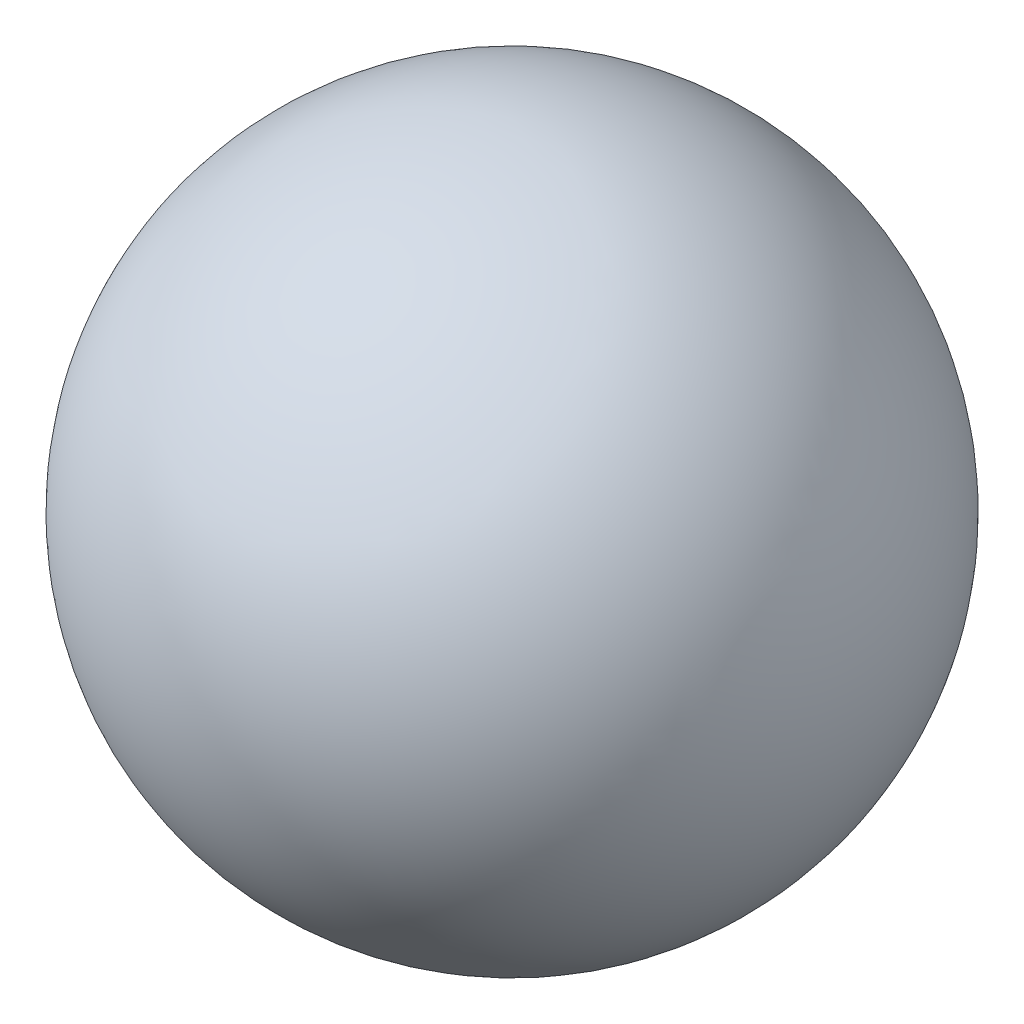
ISO-10303-21;
HEADER;
FILE_DESCRIPTION(('STEP AP214'),'2;1');
FILE_NAME('part.step','',(''),(''),'','','');
FILE_SCHEMA(('AUTOMOTIVE_DESIGN { 1 0 10303 214 1 1 1 1 }'));
ENDSEC;
DATA;
#1=APPLICATION_CONTEXT('core data for automotive mechanical design processes');
#2=APPLICATION_PROTOCOL_DEFINITION('international standard','automotive_design',2000,#1);
#3=PRODUCT_CONTEXT('',#1,'mechanical');
#4=PRODUCT('Part','Part','',(#3));
#5=PRODUCT_RELATED_PRODUCT_CATEGORY('part','',(#4));
#6=PRODUCT_DEFINITION_FORMATION('','',#4);
#7=PRODUCT_DEFINITION_CONTEXT('part definition',#1,'design');
#8=PRODUCT_DEFINITION('design','',#6,#7);
#9=PRODUCT_DEFINITION_SHAPE('','',#8);
#10=(LENGTH_UNIT() NAMED_UNIT(*) SI_UNIT(.MILLI.,.METRE.));
#11=(NAMED_UNIT(*) PLANE_ANGLE_UNIT() SI_UNIT($,.RADIAN.));
#12=(NAMED_UNIT(*) SI_UNIT($,.STERADIAN.) SOLID_ANGLE_UNIT());
#13=UNCERTAINTY_MEASURE_WITH_UNIT(LENGTH_MEASURE(1.E-05),#10,'distance_accuracy_value','');
#14=(GEOMETRIC_REPRESENTATION_CONTEXT(3) GLOBAL_UNCERTAINTY_ASSIGNED_CONTEXT((#13)) GLOBAL_UNIT_ASSIGNED_CONTEXT((#10,
#11,#12)) REPRESENTATION_CONTEXT('',''));
#15=CARTESIAN_POINT('',(0.,0.,0.));
#16=DIRECTION('',(0.,0.,1.));
#17=DIRECTION('',(1.,0.,0.));
#18=AXIS2_PLACEMENT_3D('',#15,#16,#17);
#19=CARTESIAN_POINT('',(0.,0.,0.));
#20=DIRECTION('',(1.,0.,0.));
#21=DIRECTION('',(0.,-1.,0.));
#22=AXIS2_PLACEMENT_3D('',#19,#20,#21);
#23=SPHERICAL_SURFACE('',#22,11.);
#24=CARTESIAN_POINT('',(11.,0.,0.));
#25=VERTEX_POINT('',#24);
#26=VERTEX_LOOP('',#25);
#27=FACE_BOUND('',#26,.T.);
#28=ADVANCED_FACE('F39',(#27),#23,.T.);
#29=CLOSED_SHELL('',(#28));
#30=MANIFOLD_SOLID_BREP('B2',#29);
#31=ADVANCED_BREP_SHAPE_REPRESENTATION('',(#18,#30),#14);
#32=SHAPE_DEFINITION_REPRESENTATION(#9,#31);
ENDSEC;
END-ISO-10303-21;
